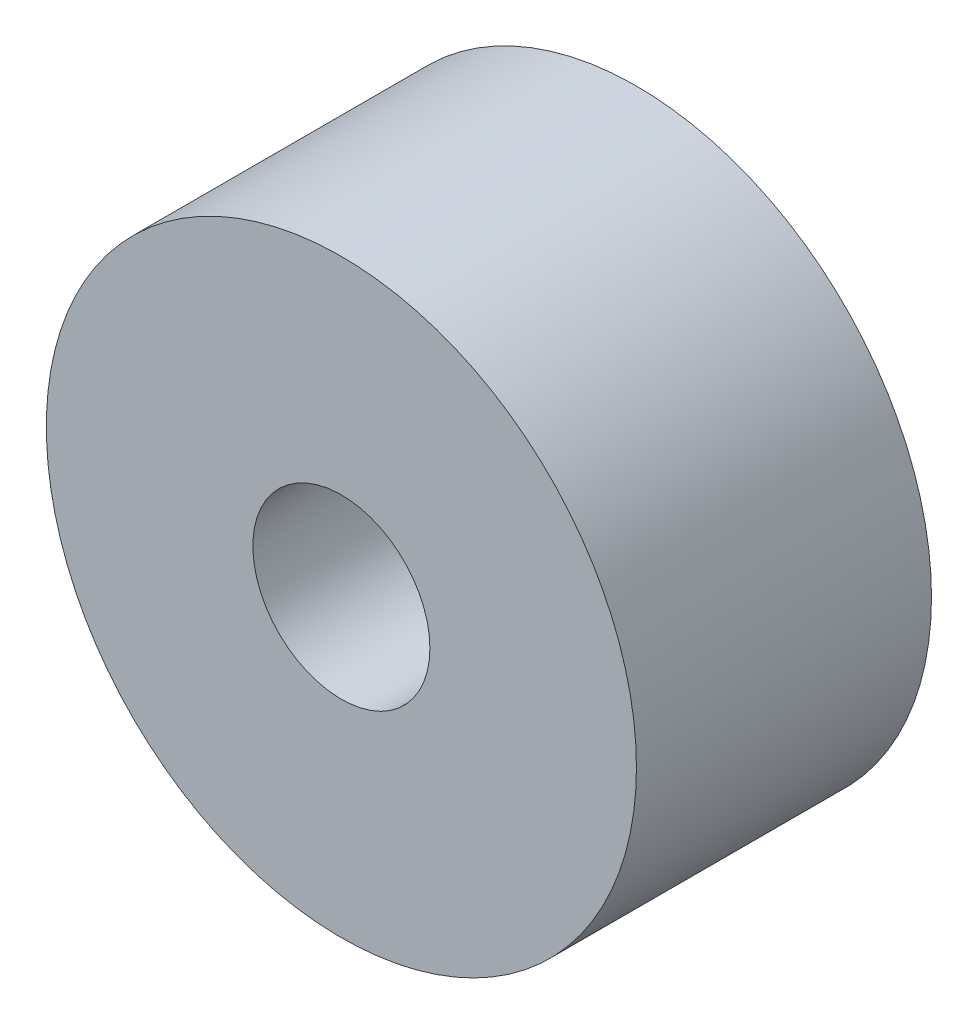
ISO-10303-21;
HEADER;
FILE_DESCRIPTION(('STEP AP214'),'2;1');
FILE_NAME('part.step','',(''),(''),'','','');
FILE_SCHEMA(('AUTOMOTIVE_DESIGN { 1 0 10303 214 1 1 1 1 }'));
ENDSEC;
DATA;
#1=APPLICATION_CONTEXT('core data for automotive mechanical design processes');
#2=APPLICATION_PROTOCOL_DEFINITION('international standard','automotive_design',2000,#1);
#3=PRODUCT_CONTEXT('',#1,'mechanical');
#4=PRODUCT('Part','Part','',(#3));
#5=PRODUCT_RELATED_PRODUCT_CATEGORY('part','',(#4));
#6=PRODUCT_DEFINITION_FORMATION('','',#4);
#7=PRODUCT_DEFINITION_CONTEXT('part definition',#1,'design');
#8=PRODUCT_DEFINITION('design','',#6,#7);
#9=PRODUCT_DEFINITION_SHAPE('','',#8);
#10=(LENGTH_UNIT() NAMED_UNIT(*) SI_UNIT(.MILLI.,.METRE.));
#11=(NAMED_UNIT(*) PLANE_ANGLE_UNIT() SI_UNIT($,.RADIAN.));
#12=(NAMED_UNIT(*) SI_UNIT($,.STERADIAN.) SOLID_ANGLE_UNIT());
#13=UNCERTAINTY_MEASURE_WITH_UNIT(LENGTH_MEASURE(1.E-05),#10,'distance_accuracy_value','');
#14=(GEOMETRIC_REPRESENTATION_CONTEXT(3) GLOBAL_UNCERTAINTY_ASSIGNED_CONTEXT((#13)) GLOBAL_UNIT_ASSIGNED_CONTEXT((#10,
#11,#12)) REPRESENTATION_CONTEXT('',''));
#15=CARTESIAN_POINT('',(0.,0.,0.));
#16=DIRECTION('',(0.,0.,1.));
#17=DIRECTION('',(1.,0.,0.));
#18=AXIS2_PLACEMENT_3D('',#15,#16,#17);
#19=CARTESIAN_POINT('',(0.,0.,2.5));
#20=DIRECTION('',(0.,0.,1.));
#21=DIRECTION('',(1.,0.,0.));
#22=AXIS2_PLACEMENT_3D('',#19,#20,#21);
#23=PLANE('',#22);
#24=CARTESIAN_POINT('',(0.,0.,2.5));
#25=DIRECTION('',(0.,0.,1.));
#26=DIRECTION('',(1.,0.,0.));
#27=AXIS2_PLACEMENT_3D('',#24,#25,#26);
#28=CIRCLE('',#27,2.5);
#29=CARTESIAN_POINT('',(2.5,0.,2.5));
#30=VERTEX_POINT('',#29);
#31=EDGE_CURVE('E10',#30,#30,#28,.T.);
#32=ORIENTED_EDGE('',*,*,#31,.T.);
#33=EDGE_LOOP('',(#32));
#34=FACE_BOUND('',#33,.T.);
#35=CARTESIAN_POINT('',(0.,0.,2.5));
#36=DIRECTION('',(0.,0.,1.));
#37=DIRECTION('',(1.,0.,0.));
#38=AXIS2_PLACEMENT_3D('',#35,#36,#37);
#39=CIRCLE('',#38,0.75);
#40=CARTESIAN_POINT('',(0.75,0.,2.5));
#41=VERTEX_POINT('',#40);
#42=EDGE_CURVE('E45',#41,#41,#39,.T.);
#43=ORIENTED_EDGE('',*,*,#42,.F.);
#44=EDGE_LOOP('',(#43));
#45=FACE_BOUND('',#44,.T.);
#46=ADVANCED_FACE('F34',(#34,#45),#23,.T.);
#47=CARTESIAN_POINT('',(0.,0.,0.));
#48=DIRECTION('',(0.,0.,1.));
#49=DIRECTION('',(1.,0.,0.));
#50=AXIS2_PLACEMENT_3D('',#47,#48,#49);
#51=PLANE('',#50);
#52=CARTESIAN_POINT('',(0.,0.,0.));
#53=DIRECTION('',(0.,0.,1.));
#54=DIRECTION('',(1.,0.,0.));
#55=AXIS2_PLACEMENT_3D('',#52,#53,#54);
#56=CIRCLE('',#55,2.5);
#57=CARTESIAN_POINT('',(2.5,0.,0.));
#58=VERTEX_POINT('',#57);
#59=EDGE_CURVE('E38',#58,#58,#56,.T.);
#60=ORIENTED_EDGE('',*,*,#59,.F.);
#61=EDGE_LOOP('',(#60));
#62=FACE_BOUND('',#61,.T.);
#63=CARTESIAN_POINT('',(0.,0.,0.));
#64=DIRECTION('',(0.,0.,1.));
#65=DIRECTION('',(1.,0.,0.));
#66=AXIS2_PLACEMENT_3D('',#63,#64,#65);
#67=CIRCLE('',#66,0.75);
#68=CARTESIAN_POINT('',(0.75,0.,0.));
#69=VERTEX_POINT('',#68);
#70=EDGE_CURVE('E47',#69,#69,#67,.T.);
#71=ORIENTED_EDGE('',*,*,#70,.T.);
#72=EDGE_LOOP('',(#71));
#73=FACE_BOUND('',#72,.T.);
#74=ADVANCED_FACE('F57',(#62,#73),#51,.F.);
#75=CARTESIAN_POINT('',(0.,0.,2.5));
#76=DIRECTION('',(0.,0.,-1.));
#77=DIRECTION('',(-1.,0.,0.));
#78=AXIS2_PLACEMENT_3D('',#75,#76,#77);
#79=CYLINDRICAL_SURFACE('',#78,2.5);
#80=ORIENTED_EDGE('',*,*,#31,.F.);
#81=EDGE_LOOP('',(#80));
#82=FACE_BOUND('',#81,.T.);
#83=ORIENTED_EDGE('',*,*,#59,.T.);
#84=EDGE_LOOP('',(#83));
#85=FACE_BOUND('',#84,.T.);
#86=ADVANCED_FACE('F36',(#82,#85),#79,.T.);
#87=CARTESIAN_POINT('',(0.,0.,2.5));
#88=DIRECTION('',(0.,0.,-1.));
#89=DIRECTION('',(-1.,0.,0.));
#90=AXIS2_PLACEMENT_3D('',#87,#88,#89);
#91=CYLINDRICAL_SURFACE('',#90,0.75);
#92=ORIENTED_EDGE('',*,*,#42,.T.);
#93=EDGE_LOOP('',(#92));
#94=FACE_BOUND('',#93,.T.);
#95=ORIENTED_EDGE('',*,*,#70,.F.);
#96=EDGE_LOOP('',(#95));
#97=FACE_BOUND('',#96,.T.);
#98=ADVANCED_FACE('F53',(#94,#97),#91,.F.);
#99=CLOSED_SHELL('',(#46,#74,#86,#98));
#100=MANIFOLD_SOLID_BREP('B2',#99);
#101=ADVANCED_BREP_SHAPE_REPRESENTATION('',(#18,#100),#14);
#102=SHAPE_DEFINITION_REPRESENTATION(#9,#101);
ENDSEC;
END-ISO-10303-21;
